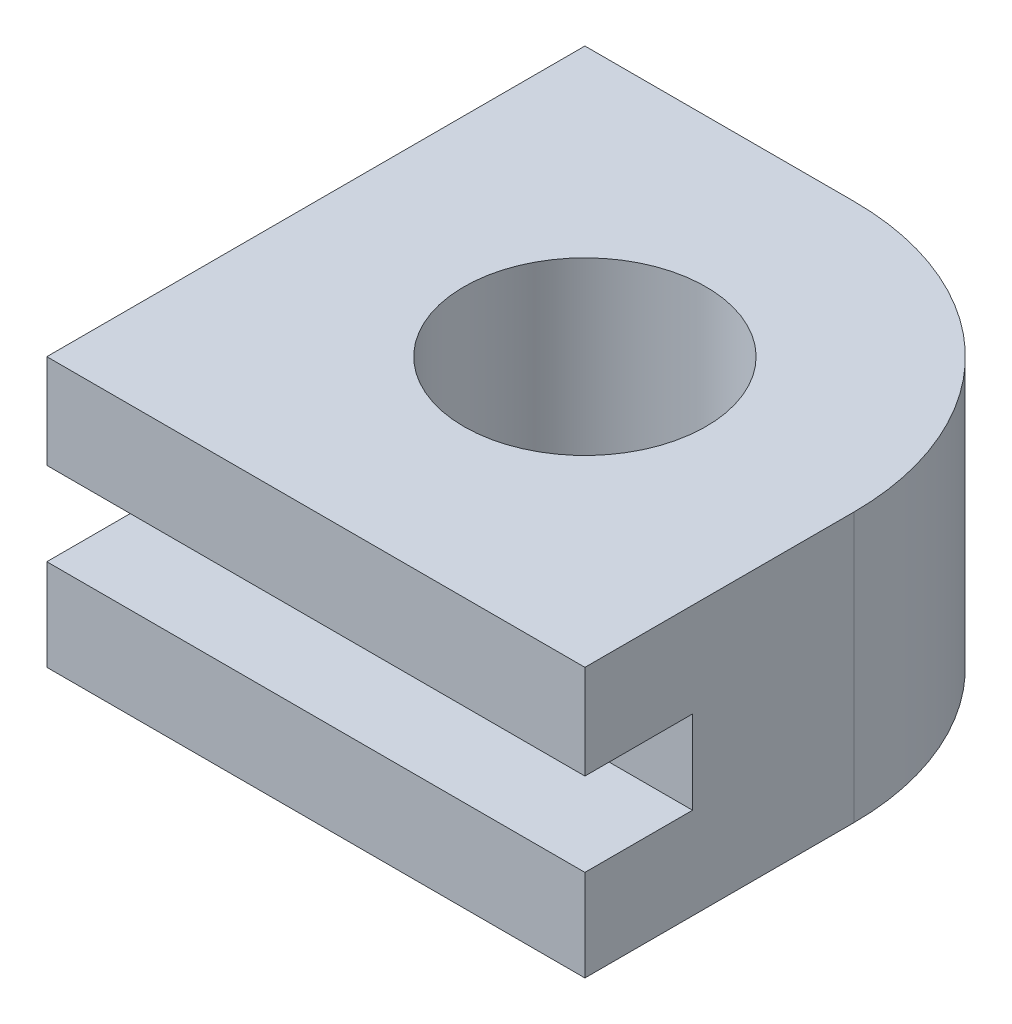
ISO-10303-21;
HEADER;
FILE_DESCRIPTION(('STEP AP214'),'2;1');
FILE_NAME('part.step','',(''),(''),'','','');
FILE_SCHEMA(('AUTOMOTIVE_DESIGN { 1 0 10303 214 1 1 1 1 }'));
ENDSEC;
DATA;
#1=APPLICATION_CONTEXT('core data for automotive mechanical design processes');
#2=APPLICATION_PROTOCOL_DEFINITION('international standard','automotive_design',2000,#1);
#3=PRODUCT_CONTEXT('',#1,'mechanical');
#4=PRODUCT('Part','Part','',(#3));
#5=PRODUCT_RELATED_PRODUCT_CATEGORY('part','',(#4));
#6=PRODUCT_DEFINITION_FORMATION('','',#4);
#7=PRODUCT_DEFINITION_CONTEXT('part definition',#1,'design');
#8=PRODUCT_DEFINITION('design','',#6,#7);
#9=PRODUCT_DEFINITION_SHAPE('','',#8);
#10=(LENGTH_UNIT() NAMED_UNIT(*) SI_UNIT(.MILLI.,.METRE.));
#11=(NAMED_UNIT(*) PLANE_ANGLE_UNIT() SI_UNIT($,.RADIAN.));
#12=(NAMED_UNIT(*) SI_UNIT($,.STERADIAN.) SOLID_ANGLE_UNIT());
#13=UNCERTAINTY_MEASURE_WITH_UNIT(LENGTH_MEASURE(1.E-05),#10,'distance_accuracy_value','');
#14=(GEOMETRIC_REPRESENTATION_CONTEXT(3) GLOBAL_UNCERTAINTY_ASSIGNED_CONTEXT((#13)) GLOBAL_UNIT_ASSIGNED_CONTEXT((#10,
#11,#12)) REPRESENTATION_CONTEXT('',''));
#15=CARTESIAN_POINT('',(0.,0.,0.));
#16=DIRECTION('',(0.,0.,1.));
#17=DIRECTION('',(1.,0.,0.));
#18=AXIS2_PLACEMENT_3D('',#15,#16,#17);
#19=CARTESIAN_POINT('',(-5.,5.,-5.));
#20=DIRECTION('',(1.,0.,0.));
#21=DIRECTION('',(0.,0.,-1.));
#22=AXIS2_PLACEMENT_3D('',#19,#20,#21);
#23=PLANE('',#22);
#24=DIRECTION('',(0.,0.,1.));
#25=VECTOR('',#24,1.);
#26=CARTESIAN_POINT('',(-5.,3.25,-5.));
#27=LINE('',#26,#25);
#28=CARTESIAN_POINT('',(-5.,3.25,-5.));
#29=VERTEX_POINT('',#28);
#30=CARTESIAN_POINT('',(-5.,3.25,5.));
#31=VERTEX_POINT('',#30);
#32=EDGE_CURVE('E208',#29,#31,#27,.T.);
#33=ORIENTED_EDGE('',*,*,#32,.T.);
#34=DIRECTION('',(0.,-1.,0.));
#35=VECTOR('',#34,1.);
#36=CARTESIAN_POINT('',(-5.,5.,5.));
#37=LINE('',#36,#35);
#38=CARTESIAN_POINT('',(-5.,5.,5.));
#39=VERTEX_POINT('',#38);
#40=EDGE_CURVE('E151',#39,#31,#37,.T.);
#41=ORIENTED_EDGE('',*,*,#40,.F.);
#42=DIRECTION('',(0.,0.,1.));
#43=VECTOR('',#42,1.);
#44=CARTESIAN_POINT('',(-5.,5.,-5.));
#45=LINE('',#44,#43);
#46=CARTESIAN_POINT('',(-5.,5.,-5.));
#47=VERTEX_POINT('',#46);
#48=EDGE_CURVE('E173',#47,#39,#45,.T.);
#49=ORIENTED_EDGE('',*,*,#48,.F.);
#50=DIRECTION('',(0.,-1.,0.));
#51=VECTOR('',#50,1.);
#52=CARTESIAN_POINT('',(-5.,5.,-5.));
#53=LINE('',#52,#51);
#54=EDGE_CURVE('E182',#47,#29,#53,.T.);
#55=ORIENTED_EDGE('',*,*,#54,.T.);
#56=EDGE_LOOP('',(#33,#41,#49,#55));
#57=FACE_BOUND('',#56,.T.);
#58=ADVANCED_FACE('F41',(#57),#23,.F.);
#59=CARTESIAN_POINT('',(5.,5.,5.));
#60=DIRECTION('',(0.,0.,-1.));
#61=DIRECTION('',(-1.,0.,0.));
#62=AXIS2_PLACEMENT_3D('',#59,#60,#61);
#63=PLANE('',#62);
#64=DIRECTION('',(1.,0.,0.));
#65=VECTOR('',#64,1.);
#66=CARTESIAN_POINT('',(5.,3.25,5.));
#67=LINE('',#66,#65);
#68=CARTESIAN_POINT('',(5.,3.25,5.));
#69=VERTEX_POINT('',#68);
#70=EDGE_CURVE('E205',#31,#69,#67,.T.);
#71=ORIENTED_EDGE('',*,*,#70,.T.);
#72=DIRECTION('',(0.,-1.,0.));
#73=VECTOR('',#72,1.);
#74=CARTESIAN_POINT('',(5.,5.,5.));
#75=LINE('',#74,#73);
#76=CARTESIAN_POINT('',(5.,5.,5.));
#77=VERTEX_POINT('',#76);
#78=EDGE_CURVE('E152',#77,#69,#75,.T.);
#79=ORIENTED_EDGE('',*,*,#78,.F.);
#80=DIRECTION('',(1.,0.,0.));
#81=VECTOR('',#80,1.);
#82=CARTESIAN_POINT('',(5.,5.,5.));
#83=LINE('',#82,#81);
#84=EDGE_CURVE('E177',#39,#77,#83,.T.);
#85=ORIENTED_EDGE('',*,*,#84,.F.);
#86=ORIENTED_EDGE('',*,*,#40,.T.);
#87=EDGE_LOOP('',(#71,#79,#85,#86));
#88=FACE_BOUND('',#87,.T.);
#89=ADVANCED_FACE('F204',(#88),#63,.F.);
#90=CARTESIAN_POINT('',(0.,5.,0.));
#91=DIRECTION('',(0.,-1.,0.));
#92=DIRECTION('',(0.,0.,-1.));
#93=AXIS2_PLACEMENT_3D('',#90,#91,#92);
#94=PLANE('',#93);
#95=DIRECTION('',(0.,0.,-1.));
#96=VECTOR('',#95,1.);
#97=CARTESIAN_POINT('',(5.,5.,-5.));
#98=LINE('',#97,#96);
#99=CARTESIAN_POINT('',(5.,5.,0.));
#100=VERTEX_POINT('',#99);
#101=EDGE_CURVE('E188',#77,#100,#98,.T.);
#102=ORIENTED_EDGE('',*,*,#101,.T.);
#103=CARTESIAN_POINT('',(0.,5.,0.));
#104=DIRECTION('',(0.,-1.,0.));
#105=DIRECTION('',(0.,0.,-1.));
#106=AXIS2_PLACEMENT_3D('',#103,#104,#105);
#107=CIRCLE('',#106,5.);
#108=CARTESIAN_POINT('',(0.,5.,-5.));
#109=VERTEX_POINT('',#108);
#110=EDGE_CURVE('E11',#100,#109,#107,.F.);
#111=ORIENTED_EDGE('',*,*,#110,.T.);
#112=DIRECTION('',(-1.,0.,0.));
#113=VECTOR('',#112,1.);
#114=CARTESIAN_POINT('',(5.,5.,-5.));
#115=LINE('',#114,#113);
#116=EDGE_CURVE('E168',#109,#47,#115,.T.);
#117=ORIENTED_EDGE('',*,*,#116,.T.);
#118=ORIENTED_EDGE('',*,*,#48,.T.);
#119=ORIENTED_EDGE('',*,*,#84,.T.);
#120=EDGE_LOOP('',(#102,#111,#117,#118,#119));
#121=FACE_BOUND('',#120,.T.);
#122=CARTESIAN_POINT('',(0.,5.,0.));
#123=DIRECTION('',(0.,1.,0.));
#124=DIRECTION('',(0.,0.,1.));
#125=AXIS2_PLACEMENT_3D('',#122,#123,#124);
#126=CIRCLE('',#125,2.25);
#127=CARTESIAN_POINT('',(0.,5.,2.25));
#128=VERTEX_POINT('',#127);
#129=EDGE_CURVE('E194',#128,#128,#126,.T.);
#130=ORIENTED_EDGE('',*,*,#129,.F.);
#131=EDGE_LOOP('',(#130));
#132=FACE_BOUND('',#131,.T.);
#133=ADVANCED_FACE('F196',(#121,#132),#94,.F.);
#134=CARTESIAN_POINT('',(0.,0.,0.));
#135=DIRECTION('',(0.,-1.,0.));
#136=DIRECTION('',(0.,0.,-1.));
#137=AXIS2_PLACEMENT_3D('',#134,#135,#136);
#138=PLANE('',#137);
#139=DIRECTION('',(-1.,0.,0.));
#140=VECTOR('',#139,1.);
#141=CARTESIAN_POINT('',(5.,0.,-5.));
#142=LINE('',#141,#140);
#143=CARTESIAN_POINT('',(0.,0.,-5.));
#144=VERTEX_POINT('',#143);
#145=CARTESIAN_POINT('',(-5.,0.,-5.));
#146=VERTEX_POINT('',#145);
#147=EDGE_CURVE('E166',#144,#146,#142,.T.);
#148=ORIENTED_EDGE('',*,*,#147,.F.);
#149=CARTESIAN_POINT('',(0.,0.,0.));
#150=DIRECTION('',(0.,-1.,0.));
#151=DIRECTION('',(0.,0.,-1.));
#152=AXIS2_PLACEMENT_3D('',#149,#150,#151);
#153=CIRCLE('',#152,5.);
#154=CARTESIAN_POINT('',(5.,0.,0.));
#155=VERTEX_POINT('',#154);
#156=EDGE_CURVE('E63',#144,#155,#153,.T.);
#157=ORIENTED_EDGE('',*,*,#156,.T.);
#158=DIRECTION('',(0.,0.,-1.));
#159=VECTOR('',#158,1.);
#160=CARTESIAN_POINT('',(5.,0.,-5.));
#161=LINE('',#160,#159);
#162=CARTESIAN_POINT('',(5.,0.,5.));
#163=VERTEX_POINT('',#162);
#164=EDGE_CURVE('E174',#163,#155,#161,.T.);
#165=ORIENTED_EDGE('',*,*,#164,.F.);
#166=DIRECTION('',(1.,0.,0.));
#167=VECTOR('',#166,1.);
#168=CARTESIAN_POINT('',(5.,0.,5.));
#169=LINE('',#168,#167);
#170=CARTESIAN_POINT('',(-5.,0.,5.));
#171=VERTEX_POINT('',#170);
#172=EDGE_CURVE('E179',#171,#163,#169,.T.);
#173=ORIENTED_EDGE('',*,*,#172,.F.);
#174=DIRECTION('',(0.,0.,1.));
#175=VECTOR('',#174,1.);
#176=CARTESIAN_POINT('',(-5.,0.,-5.));
#177=LINE('',#176,#175);
#178=EDGE_CURVE('E150',#146,#171,#177,.T.);
#179=ORIENTED_EDGE('',*,*,#178,.F.);
#180=EDGE_LOOP('',(#148,#157,#165,#173,#179));
#181=FACE_BOUND('',#180,.T.);
#182=CARTESIAN_POINT('',(0.,0.,0.));
#183=DIRECTION('',(0.,1.,0.));
#184=DIRECTION('',(0.,0.,1.));
#185=AXIS2_PLACEMENT_3D('',#182,#183,#184);
#186=CIRCLE('',#185,2.25);
#187=CARTESIAN_POINT('',(0.,0.,2.25));
#188=VERTEX_POINT('',#187);
#189=EDGE_CURVE('E224',#188,#188,#186,.T.);
#190=ORIENTED_EDGE('',*,*,#189,.T.);
#191=EDGE_LOOP('',(#190));
#192=FACE_BOUND('',#191,.T.);
#193=ADVANCED_FACE('F171',(#181,#192),#138,.T.);
#194=CARTESIAN_POINT('',(-5.,1.7,5.));
#195=VERTEX_POINT('',#194);
#196=EDGE_CURVE('E142',#195,#171,#37,.T.);
#197=ORIENTED_EDGE('',*,*,#196,.F.);
#198=DIRECTION('',(0.,0.,1.));
#199=VECTOR('',#198,1.);
#200=CARTESIAN_POINT('',(-5.,1.7,-5.));
#201=LINE('',#200,#199);
#202=CARTESIAN_POINT('',(-5.,1.7,-5.));
#203=VERTEX_POINT('',#202);
#204=EDGE_CURVE('E123',#203,#195,#201,.T.);
#205=ORIENTED_EDGE('',*,*,#204,.F.);
#206=EDGE_CURVE('E184',#203,#146,#53,.T.);
#207=ORIENTED_EDGE('',*,*,#206,.T.);
#208=ORIENTED_EDGE('',*,*,#178,.T.);
#209=EDGE_LOOP('',(#197,#205,#207,#208));
#210=FACE_BOUND('',#209,.T.);
#211=ADVANCED_FACE('F148',(#210),#23,.F.);
#212=CARTESIAN_POINT('',(5.,1.7,5.));
#213=VERTEX_POINT('',#212);
#214=EDGE_CURVE('E144',#213,#163,#75,.T.);
#215=ORIENTED_EDGE('',*,*,#214,.F.);
#216=DIRECTION('',(1.,0.,0.));
#217=VECTOR('',#216,1.);
#218=CARTESIAN_POINT('',(5.,1.7,5.));
#219=LINE('',#218,#217);
#220=EDGE_CURVE('E127',#195,#213,#219,.T.);
#221=ORIENTED_EDGE('',*,*,#220,.F.);
#222=ORIENTED_EDGE('',*,*,#196,.T.);
#223=ORIENTED_EDGE('',*,*,#172,.T.);
#224=EDGE_LOOP('',(#215,#221,#222,#223));
#225=FACE_BOUND('',#224,.T.);
#226=ADVANCED_FACE('F140',(#225),#63,.F.);
#227=CARTESIAN_POINT('',(5.,5.,-5.));
#228=DIRECTION('',(-1.,0.,0.));
#229=DIRECTION('',(0.,0.,1.));
#230=AXIS2_PLACEMENT_3D('',#227,#228,#229);
#231=PLANE('',#230);
#232=ORIENTED_EDGE('',*,*,#164,.T.);
#233=DIRECTION('',(0.,-1.,0.));
#234=VECTOR('',#233,1.);
#235=CARTESIAN_POINT('',(5.,5.,0.));
#236=LINE('',#235,#234);
#237=EDGE_CURVE('E49',#155,#100,#236,.F.);
#238=ORIENTED_EDGE('',*,*,#237,.T.);
#239=ORIENTED_EDGE('',*,*,#101,.F.);
#240=ORIENTED_EDGE('',*,*,#78,.T.);
#241=DIRECTION('',(0.,0.,-1.));
#242=VECTOR('',#241,1.);
#243=CARTESIAN_POINT('',(5.,3.25,3.));
#244=LINE('',#243,#242);
#245=CARTESIAN_POINT('',(5.,3.25,3.));
#246=VERTEX_POINT('',#245);
#247=EDGE_CURVE('E201',#69,#246,#244,.T.);
#248=ORIENTED_EDGE('',*,*,#247,.T.);
#249=DIRECTION('',(0.,1.,0.));
#250=VECTOR('',#249,1.);
#251=CARTESIAN_POINT('',(5.,1.7,3.));
#252=LINE('',#251,#250);
#253=CARTESIAN_POINT('',(5.,1.7,3.));
#254=VERTEX_POINT('',#253);
#255=EDGE_CURVE('E227',#254,#246,#252,.T.);
#256=ORIENTED_EDGE('',*,*,#255,.F.);
#257=DIRECTION('',(0.,0.,-1.));
#258=VECTOR('',#257,1.);
#259=CARTESIAN_POINT('',(5.,1.7,3.));
#260=LINE('',#259,#258);
#261=EDGE_CURVE('E145',#213,#254,#260,.T.);
#262=ORIENTED_EDGE('',*,*,#261,.F.);
#263=ORIENTED_EDGE('',*,*,#214,.T.);
#264=EDGE_LOOP('',(#232,#238,#239,#240,#248,#256,#262,#263));
#265=FACE_BOUND('',#264,.T.);
#266=ADVANCED_FACE('F195',(#265),#231,.F.);
#267=CARTESIAN_POINT('',(5.,5.,-5.));
#268=DIRECTION('',(0.,0.,1.));
#269=DIRECTION('',(1.,0.,0.));
#270=AXIS2_PLACEMENT_3D('',#267,#268,#269);
#271=PLANE('',#270);
#272=ORIENTED_EDGE('',*,*,#116,.F.);
#273=DIRECTION('',(0.,-1.,0.));
#274=VECTOR('',#273,1.);
#275=CARTESIAN_POINT('',(0.,5.,-5.));
#276=LINE('',#275,#274);
#277=EDGE_CURVE('E155',#109,#144,#276,.T.);
#278=ORIENTED_EDGE('',*,*,#277,.T.);
#279=ORIENTED_EDGE('',*,*,#147,.T.);
#280=ORIENTED_EDGE('',*,*,#206,.F.);
#281=DIRECTION('',(-1.,0.,0.));
#282=VECTOR('',#281,1.);
#283=CARTESIAN_POINT('',(-3.,1.7,-5.));
#284=LINE('',#283,#282);
#285=CARTESIAN_POINT('',(-3.,1.7,-5.));
#286=VERTEX_POINT('',#285);
#287=EDGE_CURVE('E131',#286,#203,#284,.T.);
#288=ORIENTED_EDGE('',*,*,#287,.F.);
#289=DIRECTION('',(0.,1.,0.));
#290=VECTOR('',#289,1.);
#291=CARTESIAN_POINT('',(-3.,1.7,-5.));
#292=LINE('',#291,#290);
#293=CARTESIAN_POINT('',(-3.,3.25,-5.));
#294=VERTEX_POINT('',#293);
#295=EDGE_CURVE('E221',#286,#294,#292,.T.);
#296=ORIENTED_EDGE('',*,*,#295,.T.);
#297=DIRECTION('',(-1.,0.,0.));
#298=VECTOR('',#297,1.);
#299=CARTESIAN_POINT('',(-3.,3.25,-5.));
#300=LINE('',#299,#298);
#301=EDGE_CURVE('E136',#294,#29,#300,.T.);
#302=ORIENTED_EDGE('',*,*,#301,.T.);
#303=ORIENTED_EDGE('',*,*,#54,.F.);
#304=EDGE_LOOP('',(#272,#278,#279,#280,#288,#296,#302,#303));
#305=FACE_BOUND('',#304,.T.);
#306=ADVANCED_FACE('F165',(#305),#271,.F.);
#307=CARTESIAN_POINT('',(0.,5.,0.));
#308=DIRECTION('',(0.,-1.,0.));
#309=DIRECTION('',(0.,0.,-1.));
#310=AXIS2_PLACEMENT_3D('',#307,#308,#309);
#311=CYLINDRICAL_SURFACE('',#310,2.25);
#312=ORIENTED_EDGE('',*,*,#129,.T.);
#313=EDGE_LOOP('',(#312));
#314=FACE_BOUND('',#313,.T.);
#315=ORIENTED_EDGE('',*,*,#189,.F.);
#316=EDGE_LOOP('',(#315));
#317=FACE_BOUND('',#316,.T.);
#318=ADVANCED_FACE('F234',(#314,#317),#311,.F.);
#319=CARTESIAN_POINT('',(-3.,1.7,-5.));
#320=DIRECTION('',(1.,0.,0.));
#321=DIRECTION('',(0.,0.,-1.));
#322=AXIS2_PLACEMENT_3D('',#319,#320,#321);
#323=PLANE('',#322);
#324=DIRECTION('',(0.,0.,-1.));
#325=VECTOR('',#324,1.);
#326=CARTESIAN_POINT('',(-3.,3.25,-5.));
#327=LINE('',#326,#325);
#328=CARTESIAN_POINT('',(-3.,3.25,3.));
#329=VERTEX_POINT('',#328);
#330=EDGE_CURVE('E217',#329,#294,#327,.T.);
#331=ORIENTED_EDGE('',*,*,#330,.T.);
#332=ORIENTED_EDGE('',*,*,#295,.F.);
#333=DIRECTION('',(0.,0.,-1.));
#334=VECTOR('',#333,1.);
#335=CARTESIAN_POINT('',(-3.,1.7,-5.));
#336=LINE('',#335,#334);
#337=CARTESIAN_POINT('',(-3.,1.7,3.));
#338=VERTEX_POINT('',#337);
#339=EDGE_CURVE('E353',#338,#286,#336,.T.);
#340=ORIENTED_EDGE('',*,*,#339,.F.);
#341=DIRECTION('',(0.,1.,0.));
#342=VECTOR('',#341,1.);
#343=CARTESIAN_POINT('',(-3.,1.7,3.));
#344=LINE('',#343,#342);
#345=EDGE_CURVE('E225',#338,#329,#344,.T.);
#346=ORIENTED_EDGE('',*,*,#345,.T.);
#347=EDGE_LOOP('',(#331,#332,#340,#346));
#348=FACE_BOUND('',#347,.T.);
#349=ADVANCED_FACE('F236',(#348),#323,.F.);
#350=CARTESIAN_POINT('',(5.,1.7,3.));
#351=DIRECTION('',(0.,0.,-1.));
#352=DIRECTION('',(-1.,0.,0.));
#353=AXIS2_PLACEMENT_3D('',#350,#351,#352);
#354=PLANE('',#353);
#355=DIRECTION('',(-1.,0.,0.));
#356=VECTOR('',#355,1.);
#357=CARTESIAN_POINT('',(5.,3.25,3.));
#358=LINE('',#357,#356);
#359=EDGE_CURVE('E210',#246,#329,#358,.T.);
#360=ORIENTED_EDGE('',*,*,#359,.T.);
#361=ORIENTED_EDGE('',*,*,#345,.F.);
#362=DIRECTION('',(-1.,0.,0.));
#363=VECTOR('',#362,1.);
#364=CARTESIAN_POINT('',(5.,1.7,3.));
#365=LINE('',#364,#363);
#366=EDGE_CURVE('E355',#254,#338,#365,.T.);
#367=ORIENTED_EDGE('',*,*,#366,.F.);
#368=ORIENTED_EDGE('',*,*,#255,.T.);
#369=EDGE_LOOP('',(#360,#361,#367,#368));
#370=FACE_BOUND('',#369,.T.);
#371=ADVANCED_FACE('F243',(#370),#354,.F.);
#372=CARTESIAN_POINT('',(0.,1.7,0.));
#373=DIRECTION('',(0.,-1.,0.));
#374=DIRECTION('',(0.,0.,-1.));
#375=AXIS2_PLACEMENT_3D('',#372,#373,#374);
#376=PLANE('',#375);
#377=ORIENTED_EDGE('',*,*,#204,.T.);
#378=ORIENTED_EDGE('',*,*,#220,.T.);
#379=ORIENTED_EDGE('',*,*,#261,.T.);
#380=ORIENTED_EDGE('',*,*,#366,.T.);
#381=ORIENTED_EDGE('',*,*,#339,.T.);
#382=ORIENTED_EDGE('',*,*,#287,.T.);
#383=EDGE_LOOP('',(#377,#378,#379,#380,#381,#382));
#384=FACE_BOUND('',#383,.T.);
#385=ADVANCED_FACE('F125',(#384),#376,.F.);
#386=CARTESIAN_POINT('',(0.,3.25,0.));
#387=DIRECTION('',(0.,-1.,0.));
#388=DIRECTION('',(0.,0.,-1.));
#389=AXIS2_PLACEMENT_3D('',#386,#387,#388);
#390=PLANE('',#389);
#391=ORIENTED_EDGE('',*,*,#32,.F.);
#392=ORIENTED_EDGE('',*,*,#301,.F.);
#393=ORIENTED_EDGE('',*,*,#330,.F.);
#394=ORIENTED_EDGE('',*,*,#359,.F.);
#395=ORIENTED_EDGE('',*,*,#247,.F.);
#396=ORIENTED_EDGE('',*,*,#70,.F.);
#397=EDGE_LOOP('',(#391,#392,#393,#394,#395,#396));
#398=FACE_BOUND('',#397,.T.);
#399=ADVANCED_FACE('F279',(#398),#390,.T.);
#400=CARTESIAN_POINT('',(0.,5.,0.));
#401=DIRECTION('',(0.,-1.,0.));
#402=DIRECTION('',(0.,0.,-1.));
#403=AXIS2_PLACEMENT_3D('',#400,#401,#402);
#404=CYLINDRICAL_SURFACE('',#403,5.);
#405=ORIENTED_EDGE('',*,*,#110,.F.);
#406=ORIENTED_EDGE('',*,*,#237,.F.);
#407=ORIENTED_EDGE('',*,*,#156,.F.);
#408=ORIENTED_EDGE('',*,*,#277,.F.);
#409=EDGE_LOOP('',(#405,#406,#407,#408));
#410=FACE_BOUND('',#409,.T.);
#411=ADVANCED_FACE('F43',(#410),#404,.T.);
#412=CLOSED_SHELL('',(#58,#89,#133,#193,#211,#226,#266,#306,#318,#349,#371,#385,#399,#411));
#413=MANIFOLD_SOLID_BREP('B2',#412);
#414=ADVANCED_BREP_SHAPE_REPRESENTATION('',(#18,#413),#14);
#415=SHAPE_DEFINITION_REPRESENTATION(#9,#414);
ENDSEC;
END-ISO-10303-21;
